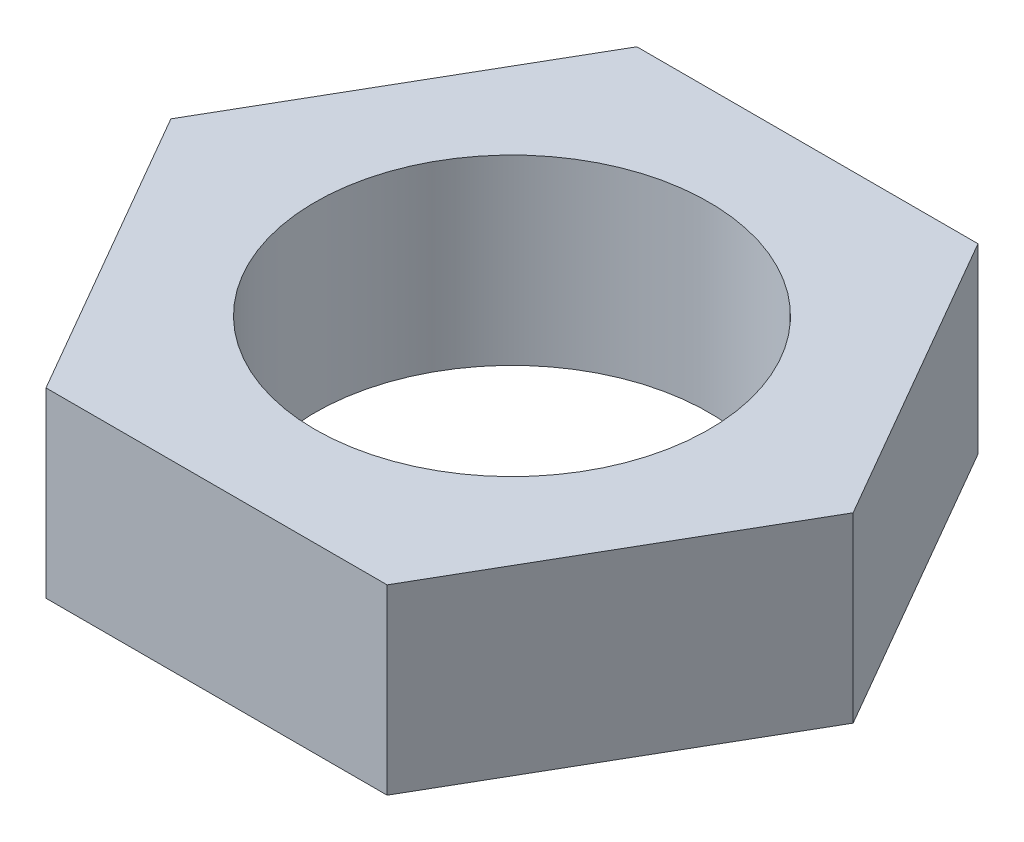
ISO-10303-21;
HEADER;
FILE_DESCRIPTION(('STEP AP214'),'2;1');
FILE_NAME('part.step','',(''),(''),'','','');
FILE_SCHEMA(('AUTOMOTIVE_DESIGN { 1 0 10303 214 1 1 1 1 }'));
ENDSEC;
DATA;
#1=APPLICATION_CONTEXT('core data for automotive mechanical design processes');
#2=APPLICATION_PROTOCOL_DEFINITION('international standard','automotive_design',2000,#1);
#3=PRODUCT_CONTEXT('',#1,'mechanical');
#4=PRODUCT('Part','Part','',(#3));
#5=PRODUCT_RELATED_PRODUCT_CATEGORY('part','',(#4));
#6=PRODUCT_DEFINITION_FORMATION('','',#4);
#7=PRODUCT_DEFINITION_CONTEXT('part definition',#1,'design');
#8=PRODUCT_DEFINITION('design','',#6,#7);
#9=PRODUCT_DEFINITION_SHAPE('','',#8);
#10=(LENGTH_UNIT() NAMED_UNIT(*) SI_UNIT(.MILLI.,.METRE.));
#11=(NAMED_UNIT(*) PLANE_ANGLE_UNIT() SI_UNIT($,.RADIAN.));
#12=(NAMED_UNIT(*) SI_UNIT($,.STERADIAN.) SOLID_ANGLE_UNIT());
#13=UNCERTAINTY_MEASURE_WITH_UNIT(LENGTH_MEASURE(1.E-05),#10,'distance_accuracy_value','');
#14=(GEOMETRIC_REPRESENTATION_CONTEXT(3) GLOBAL_UNCERTAINTY_ASSIGNED_CONTEXT((#13)) GLOBAL_UNIT_ASSIGNED_CONTEXT((#10,
#11,#12)) REPRESENTATION_CONTEXT('',''));
#15=CARTESIAN_POINT('',(0.,0.,0.));
#16=DIRECTION('',(0.,0.,1.));
#17=DIRECTION('',(1.,0.,0.));
#18=AXIS2_PLACEMENT_3D('',#15,#16,#17);
#19=CARTESIAN_POINT('',(0.,1.85,0.));
#20=DIRECTION('',(0.,1.,0.));
#21=DIRECTION('',(0.,0.,1.));
#22=AXIS2_PLACEMENT_3D('',#19,#20,#21);
#23=PLANE('',#22);
#24=DIRECTION('',(0.5,0.,-0.866025403784439));
#25=VECTOR('',#24,1.);
#26=CARTESIAN_POINT('',(1.73205080756888,1.85,3.));
#27=LINE('',#26,#25);
#28=CARTESIAN_POINT('',(1.73205080756888,1.85,3.));
#29=VERTEX_POINT('',#28);
#30=CARTESIAN_POINT('',(3.46410161513775,1.85,0.));
#31=VERTEX_POINT('',#30);
#32=EDGE_CURVE('E146',#29,#31,#27,.T.);
#33=ORIENTED_EDGE('',*,*,#32,.T.);
#34=DIRECTION('',(-0.5,0.,-0.866025403784439));
#35=VECTOR('',#34,1.);
#36=CARTESIAN_POINT('',(3.46410161513775,1.85,0.));
#37=LINE('',#36,#35);
#38=CARTESIAN_POINT('',(1.73205080756887,1.85,-3.00000000000001));
#39=VERTEX_POINT('',#38);
#40=EDGE_CURVE('E94',#31,#39,#37,.T.);
#41=ORIENTED_EDGE('',*,*,#40,.T.);
#42=DIRECTION('',(-1.,0.,0.));
#43=VECTOR('',#42,1.);
#44=CARTESIAN_POINT('',(1.73205080756887,1.85,-3.00000000000001));
#45=LINE('',#44,#43);
#46=CARTESIAN_POINT('',(-1.73205080756888,1.85,-3.00000000000001));
#47=VERTEX_POINT('',#46);
#48=EDGE_CURVE('E107',#39,#47,#45,.T.);
#49=ORIENTED_EDGE('',*,*,#48,.T.);
#50=DIRECTION('',(-0.5,0.,0.866025403784438));
#51=VECTOR('',#50,1.);
#52=CARTESIAN_POINT('',(-1.73205080756888,1.85,-3.00000000000001));
#53=LINE('',#52,#51);
#54=CARTESIAN_POINT('',(-3.46410161513776,1.85,0.));
#55=VERTEX_POINT('',#54);
#56=EDGE_CURVE('E101',#47,#55,#53,.T.);
#57=ORIENTED_EDGE('',*,*,#56,.T.);
#58=DIRECTION('',(0.5,0.,0.866025403784439));
#59=VECTOR('',#58,1.);
#60=CARTESIAN_POINT('',(-3.46410161513776,1.85,0.));
#61=LINE('',#60,#59);
#62=CARTESIAN_POINT('',(-1.73205080756888,1.85,3.));
#63=VERTEX_POINT('',#62);
#64=EDGE_CURVE('E105',#55,#63,#61,.T.);
#65=ORIENTED_EDGE('',*,*,#64,.T.);
#66=DIRECTION('',(1.,0.,0.));
#67=VECTOR('',#66,1.);
#68=CARTESIAN_POINT('',(-1.73205080756888,1.85,3.));
#69=LINE('',#68,#67);
#70=EDGE_CURVE('E57',#63,#29,#69,.T.);
#71=ORIENTED_EDGE('',*,*,#70,.T.);
#72=EDGE_LOOP('',(#33,#41,#49,#57,#65,#71));
#73=FACE_BOUND('',#72,.T.);
#74=CARTESIAN_POINT('',(0.,1.85,0.));
#75=DIRECTION('',(0.,1.,0.));
#76=DIRECTION('',(0.,0.,1.));
#77=AXIS2_PLACEMENT_3D('',#74,#75,#76);
#78=CIRCLE('',#77,2.);
#79=CARTESIAN_POINT('',(0.,1.85,2.));
#80=VERTEX_POINT('',#79);
#81=EDGE_CURVE('E134',#80,#80,#78,.T.);
#82=ORIENTED_EDGE('',*,*,#81,.F.);
#83=EDGE_LOOP('',(#82));
#84=FACE_BOUND('',#83,.T.);
#85=ADVANCED_FACE('F39',(#73,#84),#23,.T.);
#86=CARTESIAN_POINT('',(0.,0.,0.));
#87=DIRECTION('',(0.,1.,0.));
#88=DIRECTION('',(0.,0.,1.));
#89=AXIS2_PLACEMENT_3D('',#86,#87,#88);
#90=PLANE('',#89);
#91=DIRECTION('',(0.5,0.,-0.866025403784439));
#92=VECTOR('',#91,1.);
#93=CARTESIAN_POINT('',(1.73205080756888,0.,3.));
#94=LINE('',#93,#92);
#95=CARTESIAN_POINT('',(1.73205080756888,0.,3.));
#96=VERTEX_POINT('',#95);
#97=CARTESIAN_POINT('',(3.46410161513775,0.,0.));
#98=VERTEX_POINT('',#97);
#99=EDGE_CURVE('E129',#96,#98,#94,.T.);
#100=ORIENTED_EDGE('',*,*,#99,.F.);
#101=DIRECTION('',(1.,0.,0.));
#102=VECTOR('',#101,1.);
#103=CARTESIAN_POINT('',(-1.73205080756888,0.,3.));
#104=LINE('',#103,#102);
#105=CARTESIAN_POINT('',(-1.73205080756888,0.,3.));
#106=VERTEX_POINT('',#105);
#107=EDGE_CURVE('E86',#106,#96,#104,.T.);
#108=ORIENTED_EDGE('',*,*,#107,.F.);
#109=DIRECTION('',(0.5,0.,0.866025403784439));
#110=VECTOR('',#109,1.);
#111=CARTESIAN_POINT('',(-3.46410161513776,0.,0.));
#112=LINE('',#111,#110);
#113=CARTESIAN_POINT('',(-3.46410161513776,0.,0.));
#114=VERTEX_POINT('',#113);
#115=EDGE_CURVE('E80',#114,#106,#112,.T.);
#116=ORIENTED_EDGE('',*,*,#115,.F.);
#117=DIRECTION('',(-0.5,0.,0.866025403784438));
#118=VECTOR('',#117,1.);
#119=CARTESIAN_POINT('',(-1.73205080756888,0.,-3.00000000000001));
#120=LINE('',#119,#118);
#121=CARTESIAN_POINT('',(-1.73205080756888,0.,-3.00000000000001));
#122=VERTEX_POINT('',#121);
#123=EDGE_CURVE('E116',#122,#114,#120,.T.);
#124=ORIENTED_EDGE('',*,*,#123,.F.);
#125=DIRECTION('',(-1.,0.,0.));
#126=VECTOR('',#125,1.);
#127=CARTESIAN_POINT('',(1.73205080756887,0.,-3.00000000000001));
#128=LINE('',#127,#126);
#129=CARTESIAN_POINT('',(1.73205080756887,0.,-3.00000000000001));
#130=VERTEX_POINT('',#129);
#131=EDGE_CURVE('E137',#130,#122,#128,.T.);
#132=ORIENTED_EDGE('',*,*,#131,.F.);
#133=DIRECTION('',(-0.5,0.,-0.866025403784439));
#134=VECTOR('',#133,1.);
#135=CARTESIAN_POINT('',(3.46410161513775,0.,0.));
#136=LINE('',#135,#134);
#137=EDGE_CURVE('E133',#98,#130,#136,.T.);
#138=ORIENTED_EDGE('',*,*,#137,.F.);
#139=EDGE_LOOP('',(#100,#108,#116,#124,#132,#138));
#140=FACE_BOUND('',#139,.T.);
#141=CARTESIAN_POINT('',(0.,0.,0.));
#142=DIRECTION('',(0.,1.,0.));
#143=DIRECTION('',(0.,0.,1.));
#144=AXIS2_PLACEMENT_3D('',#141,#142,#143);
#145=CIRCLE('',#144,2.);
#146=CARTESIAN_POINT('',(0.,0.,2.));
#147=VERTEX_POINT('',#146);
#148=EDGE_CURVE('E243',#147,#147,#145,.T.);
#149=ORIENTED_EDGE('',*,*,#148,.T.);
#150=EDGE_LOOP('',(#149));
#151=FACE_BOUND('',#150,.T.);
#152=ADVANCED_FACE('F159',(#140,#151),#90,.F.);
#153=CARTESIAN_POINT('',(1.73205080756888,1.85,3.));
#154=DIRECTION('',(-0.866025403784439,0.,-0.5));
#155=DIRECTION('',(-0.5,0.,0.866025403784439));
#156=AXIS2_PLACEMENT_3D('',#153,#154,#155);
#157=PLANE('',#156);
#158=ORIENTED_EDGE('',*,*,#99,.T.);
#159=DIRECTION('',(0.,-1.,0.));
#160=VECTOR('',#159,1.);
#161=CARTESIAN_POINT('',(3.46410161513775,1.85,0.));
#162=LINE('',#161,#160);
#163=EDGE_CURVE('E11',#31,#98,#162,.T.);
#164=ORIENTED_EDGE('',*,*,#163,.F.);
#165=ORIENTED_EDGE('',*,*,#32,.F.);
#166=DIRECTION('',(0.,-1.,0.));
#167=VECTOR('',#166,1.);
#168=CARTESIAN_POINT('',(1.73205080756888,1.85,3.));
#169=LINE('',#168,#167);
#170=EDGE_CURVE('E125',#29,#96,#169,.T.);
#171=ORIENTED_EDGE('',*,*,#170,.T.);
#172=EDGE_LOOP('',(#158,#164,#165,#171));
#173=FACE_BOUND('',#172,.T.);
#174=ADVANCED_FACE('F41',(#173),#157,.F.);
#175=CARTESIAN_POINT('',(3.46410161513775,1.85,0.));
#176=DIRECTION('',(-0.866025403784439,0.,0.5));
#177=DIRECTION('',(0.5,0.,0.866025403784439));
#178=AXIS2_PLACEMENT_3D('',#175,#176,#177);
#179=PLANE('',#178);
#180=ORIENTED_EDGE('',*,*,#137,.T.);
#181=DIRECTION('',(0.,-1.,0.));
#182=VECTOR('',#181,1.);
#183=CARTESIAN_POINT('',(1.73205080756887,1.85,-3.00000000000001));
#184=LINE('',#183,#182);
#185=EDGE_CURVE('E49',#39,#130,#184,.T.);
#186=ORIENTED_EDGE('',*,*,#185,.F.);
#187=ORIENTED_EDGE('',*,*,#40,.F.);
#188=ORIENTED_EDGE('',*,*,#163,.T.);
#189=EDGE_LOOP('',(#180,#186,#187,#188));
#190=FACE_BOUND('',#189,.T.);
#191=ADVANCED_FACE('F184',(#190),#179,.F.);
#192=CARTESIAN_POINT('',(1.73205080756887,1.85,-3.00000000000001));
#193=DIRECTION('',(0.,0.,1.));
#194=DIRECTION('',(1.,0.,0.));
#195=AXIS2_PLACEMENT_3D('',#192,#193,#194);
#196=PLANE('',#195);
#197=ORIENTED_EDGE('',*,*,#131,.T.);
#198=DIRECTION('',(0.,-1.,0.));
#199=VECTOR('',#198,1.);
#200=CARTESIAN_POINT('',(-1.73205080756888,1.85,-3.00000000000001));
#201=LINE('',#200,#199);
#202=EDGE_CURVE('E118',#47,#122,#201,.T.);
#203=ORIENTED_EDGE('',*,*,#202,.F.);
#204=ORIENTED_EDGE('',*,*,#48,.F.);
#205=ORIENTED_EDGE('',*,*,#185,.T.);
#206=EDGE_LOOP('',(#197,#203,#204,#205));
#207=FACE_BOUND('',#206,.T.);
#208=ADVANCED_FACE('F156',(#207),#196,.F.);
#209=CARTESIAN_POINT('',(-1.73205080756888,1.85,-3.00000000000001));
#210=DIRECTION('',(0.866025403784439,0.,0.5));
#211=DIRECTION('',(0.5,0.,-0.866025403784439));
#212=AXIS2_PLACEMENT_3D('',#209,#210,#211);
#213=PLANE('',#212);
#214=ORIENTED_EDGE('',*,*,#123,.T.);
#215=DIRECTION('',(0.,-1.,0.));
#216=VECTOR('',#215,1.);
#217=CARTESIAN_POINT('',(-3.46410161513776,1.85,0.));
#218=LINE('',#217,#216);
#219=EDGE_CURVE('E113',#55,#114,#218,.T.);
#220=ORIENTED_EDGE('',*,*,#219,.F.);
#221=ORIENTED_EDGE('',*,*,#56,.F.);
#222=ORIENTED_EDGE('',*,*,#202,.T.);
#223=EDGE_LOOP('',(#214,#220,#221,#222));
#224=FACE_BOUND('',#223,.T.);
#225=ADVANCED_FACE('F114',(#224),#213,.F.);
#226=CARTESIAN_POINT('',(-3.46410161513776,1.85,0.));
#227=DIRECTION('',(0.866025403784439,0.,-0.5));
#228=DIRECTION('',(-0.5,0.,-0.866025403784439));
#229=AXIS2_PLACEMENT_3D('',#226,#227,#228);
#230=PLANE('',#229);
#231=ORIENTED_EDGE('',*,*,#115,.T.);
#232=DIRECTION('',(0.,-1.,0.));
#233=VECTOR('',#232,1.);
#234=CARTESIAN_POINT('',(-1.73205080756888,1.85,3.));
#235=LINE('',#234,#233);
#236=EDGE_CURVE('E119',#63,#106,#235,.T.);
#237=ORIENTED_EDGE('',*,*,#236,.F.);
#238=ORIENTED_EDGE('',*,*,#64,.F.);
#239=ORIENTED_EDGE('',*,*,#219,.T.);
#240=EDGE_LOOP('',(#231,#237,#238,#239));
#241=FACE_BOUND('',#240,.T.);
#242=ADVANCED_FACE('F121',(#241),#230,.F.);
#243=CARTESIAN_POINT('',(-1.73205080756888,1.85,3.));
#244=DIRECTION('',(0.,0.,-1.));
#245=DIRECTION('',(-1.,0.,0.));
#246=AXIS2_PLACEMENT_3D('',#243,#244,#245);
#247=PLANE('',#246);
#248=ORIENTED_EDGE('',*,*,#107,.T.);
#249=ORIENTED_EDGE('',*,*,#170,.F.);
#250=ORIENTED_EDGE('',*,*,#70,.F.);
#251=ORIENTED_EDGE('',*,*,#236,.T.);
#252=EDGE_LOOP('',(#248,#249,#250,#251));
#253=FACE_BOUND('',#252,.T.);
#254=ADVANCED_FACE('F164',(#253),#247,.F.);
#255=CARTESIAN_POINT('',(0.,1.85,0.));
#256=DIRECTION('',(0.,-1.,0.));
#257=DIRECTION('',(0.,0.,-1.));
#258=AXIS2_PLACEMENT_3D('',#255,#256,#257);
#259=CYLINDRICAL_SURFACE('',#258,2.);
#260=ORIENTED_EDGE('',*,*,#81,.T.);
#261=EDGE_LOOP('',(#260));
#262=FACE_BOUND('',#261,.T.);
#263=ORIENTED_EDGE('',*,*,#148,.F.);
#264=EDGE_LOOP('',(#263));
#265=FACE_BOUND('',#264,.T.);
#266=ADVANCED_FACE('F166',(#262,#265),#259,.F.);
#267=CLOSED_SHELL('',(#85,#152,#174,#191,#208,#225,#242,#254,#266));
#268=MANIFOLD_SOLID_BREP('B2',#267);
#269=ADVANCED_BREP_SHAPE_REPRESENTATION('',(#18,#268),#14);
#270=SHAPE_DEFINITION_REPRESENTATION(#9,#269);
ENDSEC;
END-ISO-10303-21;
